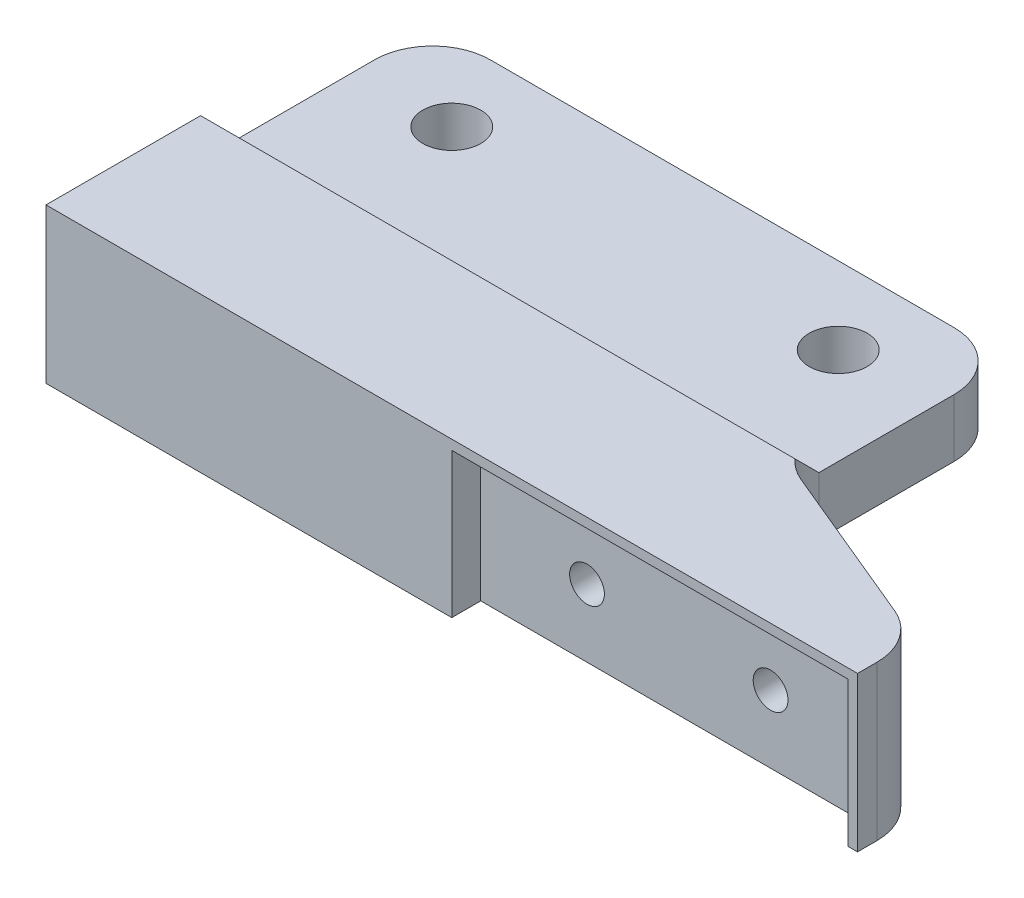
ISO-10303-21;
HEADER;
FILE_DESCRIPTION(('STEP AP214'),'2;1');
FILE_NAME('part.step','',(''),(''),'','','');
FILE_SCHEMA(('AUTOMOTIVE_DESIGN { 1 0 10303 214 1 1 1 1 }'));
ENDSEC;
DATA;
#1=APPLICATION_CONTEXT('core data for automotive mechanical design processes');
#2=APPLICATION_PROTOCOL_DEFINITION('international standard','automotive_design',2000,#1);
#3=PRODUCT_CONTEXT('',#1,'mechanical');
#4=PRODUCT('Part','Part','',(#3));
#5=PRODUCT_RELATED_PRODUCT_CATEGORY('part','',(#4));
#6=PRODUCT_DEFINITION_FORMATION('','',#4);
#7=PRODUCT_DEFINITION_CONTEXT('part definition',#1,'design');
#8=PRODUCT_DEFINITION('design','',#6,#7);
#9=PRODUCT_DEFINITION_SHAPE('','',#8);
#10=(LENGTH_UNIT() NAMED_UNIT(*) SI_UNIT(.MILLI.,.METRE.));
#11=(NAMED_UNIT(*) PLANE_ANGLE_UNIT() SI_UNIT($,.RADIAN.));
#12=(NAMED_UNIT(*) SI_UNIT($,.STERADIAN.) SOLID_ANGLE_UNIT());
#13=UNCERTAINTY_MEASURE_WITH_UNIT(LENGTH_MEASURE(1.E-05),#10,'distance_accuracy_value','');
#14=(GEOMETRIC_REPRESENTATION_CONTEXT(3) GLOBAL_UNCERTAINTY_ASSIGNED_CONTEXT((#13)) GLOBAL_UNIT_ASSIGNED_CONTEXT((#10,
#11,#12)) REPRESENTATION_CONTEXT('',''));
#15=CARTESIAN_POINT('',(0.,0.,0.));
#16=DIRECTION('',(0.,0.,1.));
#17=DIRECTION('',(1.,0.,0.));
#18=AXIS2_PLACEMENT_3D('',#15,#16,#17);
#19=CARTESIAN_POINT('',(0.,8.,0.));
#20=DIRECTION('',(0.,1.,0.));
#21=DIRECTION('',(0.,0.,1.));
#22=AXIS2_PLACEMENT_3D('',#19,#20,#21);
#23=PLANE('',#22);
#24=DIRECTION('',(0.,0.,-1.));
#25=VECTOR('',#24,1.);
#26=CARTESIAN_POINT('',(42.,8.,0.));
#27=LINE('',#26,#25);
#28=CARTESIAN_POINT('',(42.,8.,0.));
#29=VERTEX_POINT('',#28);
#30=CARTESIAN_POINT('',(42.,8.,-1.));
#31=VERTEX_POINT('',#30);
#32=EDGE_CURVE('E257',#29,#31,#27,.T.);
#33=ORIENTED_EDGE('',*,*,#32,.T.);
#34=CARTESIAN_POINT('',(39.,8.,-1.));
#35=DIRECTION('',(0.,1.,0.));
#36=DIRECTION('',(0.,0.,1.));
#37=AXIS2_PLACEMENT_3D('',#34,#35,#36);
#38=CIRCLE('',#37,3.);
#39=CARTESIAN_POINT('',(40.1538461538462,8.,-3.76923076923077));
#40=VERTEX_POINT('',#39);
#41=EDGE_CURVE('E317',#31,#40,#38,.T.);
#42=ORIENTED_EDGE('',*,*,#41,.T.);
#43=DIRECTION('',(-0.923076923076923,0.,-0.384615384615385));
#44=VECTOR('',#43,1.);
#45=CARTESIAN_POINT('',(42.,8.,-3.));
#46=LINE('',#45,#44);
#47=CARTESIAN_POINT('',(31.8461538461539,8.,-7.23076923076923));
#48=VERTEX_POINT('',#47);
#49=EDGE_CURVE('E260',#40,#48,#46,.T.);
#50=ORIENTED_EDGE('',*,*,#49,.T.);
#51=CARTESIAN_POINT('',(33.,8.,-10.));
#52=DIRECTION('',(0.,1.,0.));
#53=DIRECTION('',(0.,0.,1.));
#54=AXIS2_PLACEMENT_3D('',#51,#52,#53);
#55=CIRCLE('',#54,3.);
#56=CARTESIAN_POINT('',(30.7639320225002,8.,-8.));
#57=VERTEX_POINT('',#56);
#58=EDGE_CURVE('E322',#48,#57,#55,.F.);
#59=ORIENTED_EDGE('',*,*,#58,.T.);
#60=DIRECTION('',(-1.,0.,0.));
#61=VECTOR('',#60,1.);
#62=CARTESIAN_POINT('',(42.,8.,-8.));
#63=LINE('',#62,#61);
#64=CARTESIAN_POINT('',(0.,8.,-8.));
#65=VERTEX_POINT('',#64);
#66=EDGE_CURVE('E216',#57,#65,#63,.T.);
#67=ORIENTED_EDGE('',*,*,#66,.T.);
#68=DIRECTION('',(0.,0.,1.));
#69=VECTOR('',#68,1.);
#70=CARTESIAN_POINT('',(0.,8.,-20.));
#71=LINE('',#70,#69);
#72=CARTESIAN_POINT('',(0.,8.,0.));
#73=VERTEX_POINT('',#72);
#74=EDGE_CURVE('E252',#65,#73,#71,.T.);
#75=ORIENTED_EDGE('',*,*,#74,.T.);
#76=DIRECTION('',(1.,0.,0.));
#77=VECTOR('',#76,1.);
#78=CARTESIAN_POINT('',(0.,8.,0.));
#79=LINE('',#78,#77);
#80=EDGE_CURVE('E254',#73,#29,#79,.T.);
#81=ORIENTED_EDGE('',*,*,#80,.T.);
#82=EDGE_LOOP('',(#33,#42,#50,#59,#67,#75,#81));
#83=FACE_BOUND('',#82,.T.);
#84=ADVANCED_FACE('F35',(#83),#23,.T.);
#85=CARTESIAN_POINT('',(0.,0.,0.));
#86=DIRECTION('',(0.,1.,0.));
#87=DIRECTION('',(0.,0.,1.));
#88=AXIS2_PLACEMENT_3D('',#85,#86,#87);
#89=PLANE('',#88);
#90=DIRECTION('',(-1.,0.,0.));
#91=VECTOR('',#90,1.);
#92=CARTESIAN_POINT('',(42.,0.,-8.));
#93=LINE('',#92,#91);
#94=CARTESIAN_POINT('',(29.4,0.,-8.));
#95=VERTEX_POINT('',#94);
#96=CARTESIAN_POINT('',(0.,0.,-8.));
#97=VERTEX_POINT('',#96);
#98=EDGE_CURVE('E237',#95,#97,#93,.T.);
#99=ORIENTED_EDGE('',*,*,#98,.F.);
#100=CARTESIAN_POINT('',(29.4,0.,-5.));
#101=DIRECTION('',(0.,1.,0.));
#102=DIRECTION('',(0.,0.,1.));
#103=AXIS2_PLACEMENT_3D('',#100,#101,#102);
#104=CIRCLE('',#103,3.);
#105=CARTESIAN_POINT('',(30.5538461538462,0.,-7.76923076923077));
#106=VERTEX_POINT('',#105);
#107=EDGE_CURVE('E57',#95,#106,#104,.F.);
#108=ORIENTED_EDGE('',*,*,#107,.T.);
#109=DIRECTION('',(-0.923076923076923,0.,-0.384615384615385));
#110=VECTOR('',#109,1.);
#111=CARTESIAN_POINT('',(42.,0.,-3.));
#112=LINE('',#111,#110);
#113=CARTESIAN_POINT('',(40.1538461538462,0.,-3.76923076923077));
#114=VERTEX_POINT('',#113);
#115=EDGE_CURVE('E255',#114,#106,#112,.T.);
#116=ORIENTED_EDGE('',*,*,#115,.F.);
#117=CARTESIAN_POINT('',(39.,0.,-1.));
#118=DIRECTION('',(0.,1.,0.));
#119=DIRECTION('',(0.,0.,1.));
#120=AXIS2_PLACEMENT_3D('',#117,#118,#119);
#121=CIRCLE('',#120,3.);
#122=CARTESIAN_POINT('',(42.,0.,-1.));
#123=VERTEX_POINT('',#122);
#124=EDGE_CURVE('E313',#114,#123,#121,.F.);
#125=ORIENTED_EDGE('',*,*,#124,.T.);
#126=DIRECTION('',(0.,0.,-1.));
#127=VECTOR('',#126,1.);
#128=CARTESIAN_POINT('',(42.,0.,0.));
#129=LINE('',#128,#127);
#130=CARTESIAN_POINT('',(42.,0.,0.));
#131=VERTEX_POINT('',#130);
#132=EDGE_CURVE('E268',#131,#123,#129,.T.);
#133=ORIENTED_EDGE('',*,*,#132,.F.);
#134=DIRECTION('',(1.,0.,0.));
#135=VECTOR('',#134,1.);
#136=CARTESIAN_POINT('',(0.,0.,0.));
#137=LINE('',#136,#135);
#138=CARTESIAN_POINT('',(41.5,0.,0.));
#139=VERTEX_POINT('',#138);
#140=EDGE_CURVE('E265',#139,#131,#137,.T.);
#141=ORIENTED_EDGE('',*,*,#140,.F.);
#142=DIRECTION('',(0.,0.,1.));
#143=VECTOR('',#142,1.);
#144=CARTESIAN_POINT('',(41.5,0.,-1.5));
#145=LINE('',#144,#143);
#146=CARTESIAN_POINT('',(41.5,0.,-1.5));
#147=VERTEX_POINT('',#146);
#148=EDGE_CURVE('E172',#147,#139,#145,.T.);
#149=ORIENTED_EDGE('',*,*,#148,.F.);
#150=DIRECTION('',(1.,0.,0.));
#151=VECTOR('',#150,1.);
#152=CARTESIAN_POINT('',(21.,0.,-1.5));
#153=LINE('',#152,#151);
#154=CARTESIAN_POINT('',(21.,0.,-1.5));
#155=VERTEX_POINT('',#154);
#156=EDGE_CURVE('E180',#155,#147,#153,.T.);
#157=ORIENTED_EDGE('',*,*,#156,.F.);
#158=DIRECTION('',(0.,0.,1.));
#159=VECTOR('',#158,1.);
#160=CARTESIAN_POINT('',(21.,0.,-1.5));
#161=LINE('',#160,#159);
#162=CARTESIAN_POINT('',(21.,0.,0.));
#163=VERTEX_POINT('',#162);
#164=EDGE_CURVE('E162',#155,#163,#161,.T.);
#165=ORIENTED_EDGE('',*,*,#164,.T.);
#166=CARTESIAN_POINT('',(0.,0.,0.));
#167=VERTEX_POINT('',#166);
#168=EDGE_CURVE('E266',#167,#163,#137,.T.);
#169=ORIENTED_EDGE('',*,*,#168,.F.);
#170=DIRECTION('',(0.,0.,1.));
#171=VECTOR('',#170,1.);
#172=CARTESIAN_POINT('',(0.,0.,-20.));
#173=LINE('',#172,#171);
#174=EDGE_CURVE('E251',#97,#167,#173,.T.);
#175=ORIENTED_EDGE('',*,*,#174,.F.);
#176=EDGE_LOOP('',(#99,#108,#116,#125,#133,#141,#149,#157,#165,#169,#175));
#177=FACE_BOUND('',#176,.T.);
#178=ADVANCED_FACE('F185',(#177),#89,.F.);
#179=CARTESIAN_POINT('',(0.,8.,-20.));
#180=DIRECTION('',(1.,0.,0.));
#181=DIRECTION('',(0.,0.,-1.));
#182=AXIS2_PLACEMENT_3D('',#179,#180,#181);
#183=PLANE('',#182);
#184=DIRECTION('',(0.,0.,1.));
#185=VECTOR('',#184,1.);
#186=CARTESIAN_POINT('',(0.,6.,-20.));
#187=LINE('',#186,#185);
#188=CARTESIAN_POINT('',(0.,6.,-17.));
#189=VERTEX_POINT('',#188);
#190=CARTESIAN_POINT('',(0.,6.,-9.99999999999999));
#191=VERTEX_POINT('',#190);
#192=EDGE_CURVE('E211',#189,#191,#187,.T.);
#193=ORIENTED_EDGE('',*,*,#192,.F.);
#194=DIRECTION('',(0.,-1.,0.));
#195=VECTOR('',#194,1.);
#196=CARTESIAN_POINT('',(0.,8.,-17.));
#197=LINE('',#196,#195);
#198=CARTESIAN_POINT('',(0.,3.,-17.));
#199=VERTEX_POINT('',#198);
#200=EDGE_CURVE('E277',#189,#199,#197,.T.);
#201=ORIENTED_EDGE('',*,*,#200,.T.);
#202=DIRECTION('',(0.,0.,-1.));
#203=VECTOR('',#202,1.);
#204=CARTESIAN_POINT('',(0.,3.,-20.));
#205=LINE('',#204,#203);
#206=CARTESIAN_POINT('',(0.,3.,-8.));
#207=VERTEX_POINT('',#206);
#208=EDGE_CURVE('E234',#207,#199,#205,.T.);
#209=ORIENTED_EDGE('',*,*,#208,.F.);
#210=DIRECTION('',(0.,1.,0.));
#211=VECTOR('',#210,1.);
#212=CARTESIAN_POINT('',(0.,0.,-8.));
#213=LINE('',#212,#211);
#214=EDGE_CURVE('E231',#97,#207,#213,.T.);
#215=ORIENTED_EDGE('',*,*,#214,.F.);
#216=ORIENTED_EDGE('',*,*,#174,.T.);
#217=DIRECTION('',(0.,-1.,0.));
#218=VECTOR('',#217,1.);
#219=CARTESIAN_POINT('',(0.,8.,0.));
#220=LINE('',#219,#218);
#221=EDGE_CURVE('E274',#73,#167,#220,.T.);
#222=ORIENTED_EDGE('',*,*,#221,.F.);
#223=ORIENTED_EDGE('',*,*,#74,.F.);
#224=DIRECTION('',(0.,0.707106781186549,0.707106781186546));
#225=VECTOR('',#224,1.);
#226=CARTESIAN_POINT('',(0.,6.,-9.99999999999999));
#227=LINE('',#226,#225);
#228=EDGE_CURVE('E213',#191,#65,#227,.T.);
#229=ORIENTED_EDGE('',*,*,#228,.F.);
#230=EDGE_LOOP('',(#193,#201,#209,#215,#216,#222,#223,#229));
#231=FACE_BOUND('',#230,.T.);
#232=ADVANCED_FACE('F341',(#231),#183,.F.);
#233=CARTESIAN_POINT('',(0.,8.,0.));
#234=DIRECTION('',(0.,0.,-1.));
#235=DIRECTION('',(-1.,0.,0.));
#236=AXIS2_PLACEMENT_3D('',#233,#234,#235);
#237=PLANE('',#236);
#238=ORIENTED_EDGE('',*,*,#168,.T.);
#239=DIRECTION('',(0.,-1.,0.));
#240=VECTOR('',#239,1.);
#241=CARTESIAN_POINT('',(21.,0.,0.));
#242=LINE('',#241,#240);
#243=CARTESIAN_POINT('',(21.,7.5,0.));
#244=VERTEX_POINT('',#243);
#245=EDGE_CURVE('E168',#244,#163,#242,.T.);
#246=ORIENTED_EDGE('',*,*,#245,.F.);
#247=DIRECTION('',(-1.,0.,0.));
#248=VECTOR('',#247,1.);
#249=CARTESIAN_POINT('',(21.,7.5,0.));
#250=LINE('',#249,#248);
#251=CARTESIAN_POINT('',(41.5,7.5,0.));
#252=VERTEX_POINT('',#251);
#253=EDGE_CURVE('E183',#252,#244,#250,.T.);
#254=ORIENTED_EDGE('',*,*,#253,.F.);
#255=DIRECTION('',(0.,1.,0.));
#256=VECTOR('',#255,1.);
#257=CARTESIAN_POINT('',(41.5,0.,0.));
#258=LINE('',#257,#256);
#259=EDGE_CURVE('E193',#139,#252,#258,.T.);
#260=ORIENTED_EDGE('',*,*,#259,.F.);
#261=ORIENTED_EDGE('',*,*,#140,.T.);
#262=DIRECTION('',(0.,-1.,0.));
#263=VECTOR('',#262,1.);
#264=CARTESIAN_POINT('',(42.,8.,0.));
#265=LINE('',#264,#263);
#266=EDGE_CURVE('E263',#29,#131,#265,.T.);
#267=ORIENTED_EDGE('',*,*,#266,.F.);
#268=ORIENTED_EDGE('',*,*,#80,.F.);
#269=ORIENTED_EDGE('',*,*,#221,.T.);
#270=EDGE_LOOP('',(#238,#246,#254,#260,#261,#267,#268,#269));
#271=FACE_BOUND('',#270,.T.);
#272=ADVANCED_FACE('F381',(#271),#237,.F.);
#273=CARTESIAN_POINT('',(42.,8.,0.));
#274=DIRECTION('',(-1.,0.,0.));
#275=DIRECTION('',(0.,0.,1.));
#276=AXIS2_PLACEMENT_3D('',#273,#274,#275);
#277=PLANE('',#276);
#278=ORIENTED_EDGE('',*,*,#132,.T.);
#279=DIRECTION('',(0.,-1.,0.));
#280=VECTOR('',#279,1.);
#281=CARTESIAN_POINT('',(42.,8.,-1.));
#282=LINE('',#281,#280);
#283=EDGE_CURVE('E315',#123,#31,#282,.F.);
#284=ORIENTED_EDGE('',*,*,#283,.T.);
#285=ORIENTED_EDGE('',*,*,#32,.F.);
#286=ORIENTED_EDGE('',*,*,#266,.T.);
#287=EDGE_LOOP('',(#278,#284,#285,#286));
#288=FACE_BOUND('',#287,.T.);
#289=ADVANCED_FACE('F377',(#288),#277,.F.);
#290=CARTESIAN_POINT('',(42.,8.,-3.));
#291=DIRECTION('',(-0.384615384615385,0.,0.923076923076923));
#292=DIRECTION('',(0.923076923076923,0.,0.384615384615385));
#293=AXIS2_PLACEMENT_3D('',#290,#291,#292);
#294=PLANE('',#293);
#295=CARTESIAN_POINT('',(36.,3.5,-5.5));
#296=DIRECTION('',(-0.384615384615385,0.,0.923076923076923));
#297=DIRECTION('',(0.923076923076923,0.,0.384615384615385));
#298=AXIS2_PLACEMENT_3D('',#295,#296,#297);
#299=ELLIPSE('',#298,0.974999999999997,0.899999999999997);
#300=CARTESIAN_POINT('',(36.9,3.5,-5.125));
#301=VERTEX_POINT('',#300);
#302=EDGE_CURVE('E207',#301,#301,#299,.T.);
#303=ORIENTED_EDGE('',*,*,#302,.T.);
#304=EDGE_LOOP('',(#303));
#305=FACE_BOUND('',#304,.T.);
#306=ORIENTED_EDGE('',*,*,#115,.T.);
#307=DIRECTION('',(0.,-1.,0.));
#308=VECTOR('',#307,1.);
#309=CARTESIAN_POINT('',(30.5538461538462,8.,-7.76923076923077));
#310=LINE('',#309,#308);
#311=CARTESIAN_POINT('',(30.5538461538462,3.,-7.76923076923077));
#312=VERTEX_POINT('',#311);
#313=EDGE_CURVE('E43',#106,#312,#310,.F.);
#314=ORIENTED_EDGE('',*,*,#313,.T.);
#315=DIRECTION('',(0.923076923076923,0.,0.384615384615385));
#316=VECTOR('',#315,1.);
#317=CARTESIAN_POINT('',(35.9644970414201,3.,-5.51479289940828));
#318=LINE('',#317,#316);
#319=CARTESIAN_POINT('',(31.8461538461539,3.,-7.23076923076923));
#320=VERTEX_POINT('',#319);
#321=EDGE_CURVE('E308',#312,#320,#318,.T.);
#322=ORIENTED_EDGE('',*,*,#321,.T.);
#323=DIRECTION('',(0.,-1.,0.));
#324=VECTOR('',#323,1.);
#325=CARTESIAN_POINT('',(31.8461538461539,8.,-7.23076923076923));
#326=LINE('',#325,#324);
#327=EDGE_CURVE('E306',#320,#48,#326,.F.);
#328=ORIENTED_EDGE('',*,*,#327,.T.);
#329=ORIENTED_EDGE('',*,*,#49,.F.);
#330=DIRECTION('',(0.,-1.,0.));
#331=VECTOR('',#330,1.);
#332=CARTESIAN_POINT('',(40.1538461538462,8.,-3.76923076923077));
#333=LINE('',#332,#331);
#334=EDGE_CURVE('E310',#40,#114,#333,.T.);
#335=ORIENTED_EDGE('',*,*,#334,.T.);
#336=EDGE_LOOP('',(#306,#314,#322,#328,#329,#335));
#337=FACE_BOUND('',#336,.T.);
#338=ADVANCED_FACE('F373',(#305,#337),#294,.F.);
#339=CARTESIAN_POINT('',(30.,8.,-8.));
#340=DIRECTION('',(-1.,0.,0.));
#341=DIRECTION('',(0.,0.,1.));
#342=AXIS2_PLACEMENT_3D('',#339,#340,#341);
#343=PLANE('',#342);
#344=DIRECTION('',(0.,0.,-1.));
#345=VECTOR('',#344,1.);
#346=CARTESIAN_POINT('',(30.,3.,-8.));
#347=LINE('',#346,#345);
#348=CARTESIAN_POINT('',(30.,3.,-10.));
#349=VERTEX_POINT('',#348);
#350=CARTESIAN_POINT('',(30.,3.,-17.));
#351=VERTEX_POINT('',#350);
#352=EDGE_CURVE('E248',#349,#351,#347,.T.);
#353=ORIENTED_EDGE('',*,*,#352,.T.);
#354=DIRECTION('',(0.,-1.,0.));
#355=VECTOR('',#354,1.);
#356=CARTESIAN_POINT('',(30.,8.,-17.));
#357=LINE('',#356,#355);
#358=CARTESIAN_POINT('',(30.,6.,-17.));
#359=VERTEX_POINT('',#358);
#360=EDGE_CURVE('E304',#351,#359,#357,.F.);
#361=ORIENTED_EDGE('',*,*,#360,.T.);
#362=DIRECTION('',(0.,0.,1.));
#363=VECTOR('',#362,1.);
#364=CARTESIAN_POINT('',(30.,6.,-8.));
#365=LINE('',#364,#363);
#366=CARTESIAN_POINT('',(30.,6.,-9.99999999999999));
#367=VERTEX_POINT('',#366);
#368=EDGE_CURVE('E228',#359,#367,#365,.T.);
#369=ORIENTED_EDGE('',*,*,#368,.T.);
#370=DIRECTION('',(0.,-1.,0.));
#371=VECTOR('',#370,1.);
#372=CARTESIAN_POINT('',(30.,3.,-10.));
#373=LINE('',#372,#371);
#374=EDGE_CURVE('E301',#367,#349,#373,.T.);
#375=ORIENTED_EDGE('',*,*,#374,.T.);
#376=EDGE_LOOP('',(#353,#361,#369,#375));
#377=FACE_BOUND('',#376,.T.);
#378=ADVANCED_FACE('F369',(#377),#343,.F.);
#379=CARTESIAN_POINT('',(30.,8.,-20.));
#380=DIRECTION('',(0.,0.,1.));
#381=DIRECTION('',(1.,0.,0.));
#382=AXIS2_PLACEMENT_3D('',#379,#380,#381);
#383=PLANE('',#382);
#384=DIRECTION('',(-1.,0.,0.));
#385=VECTOR('',#384,1.);
#386=CARTESIAN_POINT('',(42.,3.,-20.));
#387=LINE('',#386,#385);
#388=CARTESIAN_POINT('',(27.,3.,-20.));
#389=VERTEX_POINT('',#388);
#390=CARTESIAN_POINT('',(3.00000000000002,3.,-20.));
#391=VERTEX_POINT('',#390);
#392=EDGE_CURVE('E238',#389,#391,#387,.T.);
#393=ORIENTED_EDGE('',*,*,#392,.T.);
#394=DIRECTION('',(0.,-1.,0.));
#395=VECTOR('',#394,1.);
#396=CARTESIAN_POINT('',(3.,8.,-20.));
#397=LINE('',#396,#395);
#398=CARTESIAN_POINT('',(3.00000000000002,6.,-20.));
#399=VERTEX_POINT('',#398);
#400=EDGE_CURVE('E295',#391,#399,#397,.F.);
#401=ORIENTED_EDGE('',*,*,#400,.T.);
#402=DIRECTION('',(-1.,0.,0.));
#403=VECTOR('',#402,1.);
#404=CARTESIAN_POINT('',(42.,6.,-20.));
#405=LINE('',#404,#403);
#406=CARTESIAN_POINT('',(27.,6.,-20.));
#407=VERTEX_POINT('',#406);
#408=EDGE_CURVE('E215',#407,#399,#405,.T.);
#409=ORIENTED_EDGE('',*,*,#408,.F.);
#410=DIRECTION('',(0.,-1.,0.));
#411=VECTOR('',#410,1.);
#412=CARTESIAN_POINT('',(27.,8.,-20.));
#413=LINE('',#412,#411);
#414=EDGE_CURVE('E292',#407,#389,#413,.T.);
#415=ORIENTED_EDGE('',*,*,#414,.T.);
#416=EDGE_LOOP('',(#393,#401,#409,#415));
#417=FACE_BOUND('',#416,.T.);
#418=ADVANCED_FACE('F366',(#417),#383,.F.);
#419=CARTESIAN_POINT('',(25.,8.,-16.));
#420=DIRECTION('',(0.,-1.,0.));
#421=DIRECTION('',(0.,0.,-1.));
#422=AXIS2_PLACEMENT_3D('',#419,#420,#421);
#423=CYLINDRICAL_SURFACE('',#422,1.5);
#424=CARTESIAN_POINT('',(25.,6.,-16.));
#425=DIRECTION('',(0.,-1.,0.));
#426=DIRECTION('',(0.,0.,-1.));
#427=AXIS2_PLACEMENT_3D('',#424,#425,#426);
#428=CIRCLE('',#427,1.5);
#429=CARTESIAN_POINT('',(25.,6.,-17.5));
#430=VERTEX_POINT('',#429);
#431=EDGE_CURVE('E225',#430,#430,#428,.T.);
#432=CARTESIAN_POINT('',(25.,3.,-16.));
#433=DIRECTION('',(0.,1.,0.));
#434=DIRECTION('',(0.,0.,1.));
#435=AXIS2_PLACEMENT_3D('',#432,#433,#434);
#436=CIRCLE('',#435,1.5);
#437=CARTESIAN_POINT('',(25.,3.,-17.5));
#438=VERTEX_POINT('',#437);
#439=EDGE_CURVE('E245',#438,#438,#436,.T.);
#440=CARTESIAN_POINT('',(25.,6.,-17.5));
#441=CARTESIAN_POINT('',(25.,5.96875,-17.5));
#442=CARTESIAN_POINT('',(25.,5.9375,-17.5));
#443=CARTESIAN_POINT('',(25.,5.875,-17.5));
#444=CARTESIAN_POINT('',(25.,5.84375,-17.5));
#445=CARTESIAN_POINT('',(25.,5.78125,-17.5));
#446=CARTESIAN_POINT('',(25.,5.75,-17.5));
#447=CARTESIAN_POINT('',(25.,5.6875,-17.5));
#448=CARTESIAN_POINT('',(25.,5.65625,-17.5));
#449=CARTESIAN_POINT('',(25.,5.59375,-17.5));
#450=CARTESIAN_POINT('',(25.,5.5625,-17.5));
#451=CARTESIAN_POINT('',(25.,5.5,-17.5));
#452=CARTESIAN_POINT('',(25.,5.46875,-17.5));
#453=CARTESIAN_POINT('',(25.,5.40625,-17.5));
#454=CARTESIAN_POINT('',(25.,5.375,-17.5));
#455=CARTESIAN_POINT('',(25.,5.3125,-17.5));
#456=CARTESIAN_POINT('',(25.,5.28125,-17.5));
#457=CARTESIAN_POINT('',(25.,5.21875,-17.5));
#458=CARTESIAN_POINT('',(25.,5.1875,-17.5));
#459=CARTESIAN_POINT('',(25.,5.125,-17.5));
#460=CARTESIAN_POINT('',(25.,5.09375,-17.5));
#461=CARTESIAN_POINT('',(25.,5.03125,-17.5));
#462=CARTESIAN_POINT('',(25.,5.,-17.5));
#463=CARTESIAN_POINT('',(25.,4.9375,-17.5));
#464=CARTESIAN_POINT('',(25.,4.90625,-17.5));
#465=CARTESIAN_POINT('',(25.,4.84375,-17.5));
#466=CARTESIAN_POINT('',(25.,4.8125,-17.5));
#467=CARTESIAN_POINT('',(25.,4.75,-17.5));
#468=CARTESIAN_POINT('',(25.,4.71875,-17.5));
#469=CARTESIAN_POINT('',(25.,4.65625,-17.5));
#470=CARTESIAN_POINT('',(25.,4.625,-17.5));
#471=CARTESIAN_POINT('',(25.,4.5625,-17.5));
#472=CARTESIAN_POINT('',(25.,4.53125,-17.5));
#473=CARTESIAN_POINT('',(25.,4.46875,-17.5));
#474=CARTESIAN_POINT('',(25.,4.4375,-17.5));
#475=CARTESIAN_POINT('',(25.,4.375,-17.5));
#476=CARTESIAN_POINT('',(25.,4.34375,-17.5));
#477=CARTESIAN_POINT('',(25.,4.28125,-17.5));
#478=CARTESIAN_POINT('',(25.,4.25,-17.5));
#479=CARTESIAN_POINT('',(25.,4.1875,-17.5));
#480=CARTESIAN_POINT('',(25.,4.15625,-17.5));
#481=CARTESIAN_POINT('',(25.,4.09375,-17.5));
#482=CARTESIAN_POINT('',(25.,4.0625,-17.5));
#483=CARTESIAN_POINT('',(25.,4.,-17.5));
#484=CARTESIAN_POINT('',(25.,3.96875,-17.5));
#485=CARTESIAN_POINT('',(25.,3.90625,-17.5));
#486=CARTESIAN_POINT('',(25.,3.875,-17.5));
#487=CARTESIAN_POINT('',(25.,3.8125,-17.5));
#488=CARTESIAN_POINT('',(25.,3.78125,-17.5));
#489=CARTESIAN_POINT('',(25.,3.71875,-17.5));
#490=CARTESIAN_POINT('',(25.,3.6875,-17.5));
#491=CARTESIAN_POINT('',(25.,3.625,-17.5));
#492=CARTESIAN_POINT('',(25.,3.59375,-17.5));
#493=CARTESIAN_POINT('',(25.,3.53125,-17.5));
#494=CARTESIAN_POINT('',(25.,3.5,-17.5));
#495=CARTESIAN_POINT('',(25.,3.4375,-17.5));
#496=CARTESIAN_POINT('',(25.,3.40625,-17.5));
#497=CARTESIAN_POINT('',(25.,3.34375,-17.5));
#498=CARTESIAN_POINT('',(25.,3.3125,-17.5));
#499=CARTESIAN_POINT('',(25.,3.25,-17.5));
#500=CARTESIAN_POINT('',(25.,3.21875,-17.5));
#501=CARTESIAN_POINT('',(25.,3.15625,-17.5));
#502=CARTESIAN_POINT('',(25.,3.125,-17.5));
#503=CARTESIAN_POINT('',(25.,3.0625,-17.5));
#504=CARTESIAN_POINT('',(25.,3.03125,-17.5));
#505=CARTESIAN_POINT('',(25.,3.,-17.5));
#506=B_SPLINE_CURVE_WITH_KNOTS('',3,(#440,#441,#442,#443,#444,#445,#446,#447,#448,#449,#450,
#451,#452,#453,#454,#455,#456,#457,#458,#459,#460,#461,#462,#463,#464,#465,#466,#467,#468,#469,
#470,#471,#472,#473,#474,#475,#476,#477,#478,#479,#480,#481,#482,#483,#484,#485,#486,#487,#488,
#489,#490,#491,#492,#493,#494,#495,#496,#497,#498,#499,#500,#501,#502,#503,#504,#505),
.UNSPECIFIED.,.F.,.F.,(4,2,2,2,2,2,2,2,2,2,2,2,2,2,2,2,2,2,2,2,2,2,2,2,2,2,2,2,2,2,2,2,4),(0.,
0.0937500000000001,0.1875,0.28125,0.375,0.46875,0.5625,0.656250000000001,0.750000000000001,
0.843750000000001,0.937500000000001,1.03125,1.125,1.21875,1.3125,1.40625,1.5,1.59375,1.6875,
1.78125,1.875,1.96875,2.0625,2.15625,2.25,2.34375,2.4375,2.53125,2.625,2.71875,2.8125,2.90625,
3.),.UNSPECIFIED.);
#507=EDGE_CURVE('BSEAM363',#430,#438,#506,.T.);
#508=ORIENTED_EDGE('',*,*,#431,.F.);
#509=ORIENTED_EDGE('',*,*,#439,.F.);
#510=ORIENTED_EDGE('',*,*,#507,.T.);
#511=ORIENTED_EDGE('',*,*,#507,.F.);
#512=EDGE_LOOP('',(#508,#510,#509,#511));
#513=FACE_BOUND('',#512,.T.);
#514=ADVANCED_FACE('F363',(#513),#423,.F.);
#515=CARTESIAN_POINT('',(5.,8.,-16.));
#516=DIRECTION('',(0.,-1.,0.));
#517=DIRECTION('',(0.,0.,-1.));
#518=AXIS2_PLACEMENT_3D('',#515,#516,#517);
#519=CYLINDRICAL_SURFACE('',#518,1.5);
#520=CARTESIAN_POINT('',(5.,6.,-16.));
#521=DIRECTION('',(0.,-1.,0.));
#522=DIRECTION('',(0.,0.,-1.));
#523=AXIS2_PLACEMENT_3D('',#520,#521,#522);
#524=CIRCLE('',#523,1.5);
#525=CARTESIAN_POINT('',(5.,6.,-17.5));
#526=VERTEX_POINT('',#525);
#527=EDGE_CURVE('E219',#526,#526,#524,.T.);
#528=CARTESIAN_POINT('',(5.,3.,-16.));
#529=DIRECTION('',(0.,1.,0.));
#530=DIRECTION('',(0.,0.,1.));
#531=AXIS2_PLACEMENT_3D('',#528,#529,#530);
#532=CIRCLE('',#531,1.5);
#533=CARTESIAN_POINT('',(5.,3.,-17.5));
#534=VERTEX_POINT('',#533);
#535=EDGE_CURVE('E241',#534,#534,#532,.T.);
#536=CARTESIAN_POINT('',(5.,6.,-17.5));
#537=CARTESIAN_POINT('',(5.,5.96875,-17.5));
#538=CARTESIAN_POINT('',(5.,5.9375,-17.5));
#539=CARTESIAN_POINT('',(5.,5.875,-17.5));
#540=CARTESIAN_POINT('',(5.,5.84375,-17.5));
#541=CARTESIAN_POINT('',(5.,5.78125,-17.5));
#542=CARTESIAN_POINT('',(5.,5.75,-17.5));
#543=CARTESIAN_POINT('',(5.,5.6875,-17.5));
#544=CARTESIAN_POINT('',(5.,5.65625,-17.5));
#545=CARTESIAN_POINT('',(5.,5.59375,-17.5));
#546=CARTESIAN_POINT('',(5.,5.5625,-17.5));
#547=CARTESIAN_POINT('',(5.,5.5,-17.5));
#548=CARTESIAN_POINT('',(5.,5.46875,-17.5));
#549=CARTESIAN_POINT('',(5.,5.40625,-17.5));
#550=CARTESIAN_POINT('',(5.,5.375,-17.5));
#551=CARTESIAN_POINT('',(5.,5.3125,-17.5));
#552=CARTESIAN_POINT('',(5.,5.28125,-17.5));
#553=CARTESIAN_POINT('',(5.,5.21875,-17.5));
#554=CARTESIAN_POINT('',(5.,5.1875,-17.5));
#555=CARTESIAN_POINT('',(5.,5.125,-17.5));
#556=CARTESIAN_POINT('',(5.,5.09375,-17.5));
#557=CARTESIAN_POINT('',(5.,5.03125,-17.5));
#558=CARTESIAN_POINT('',(5.,5.,-17.5));
#559=CARTESIAN_POINT('',(5.,4.9375,-17.5));
#560=CARTESIAN_POINT('',(5.,4.90625,-17.5));
#561=CARTESIAN_POINT('',(5.,4.84375,-17.5));
#562=CARTESIAN_POINT('',(5.,4.8125,-17.5));
#563=CARTESIAN_POINT('',(5.,4.75,-17.5));
#564=CARTESIAN_POINT('',(5.,4.71875,-17.5));
#565=CARTESIAN_POINT('',(5.,4.65625,-17.5));
#566=CARTESIAN_POINT('',(5.,4.625,-17.5));
#567=CARTESIAN_POINT('',(5.,4.5625,-17.5));
#568=CARTESIAN_POINT('',(5.,4.53125,-17.5));
#569=CARTESIAN_POINT('',(5.,4.46875,-17.5));
#570=CARTESIAN_POINT('',(5.,4.4375,-17.5));
#571=CARTESIAN_POINT('',(5.,4.375,-17.5));
#572=CARTESIAN_POINT('',(5.,4.34375,-17.5));
#573=CARTESIAN_POINT('',(5.,4.28125,-17.5));
#574=CARTESIAN_POINT('',(5.,4.25,-17.5));
#575=CARTESIAN_POINT('',(5.,4.1875,-17.5));
#576=CARTESIAN_POINT('',(5.,4.15625,-17.5));
#577=CARTESIAN_POINT('',(5.,4.09375,-17.5));
#578=CARTESIAN_POINT('',(5.,4.0625,-17.5));
#579=CARTESIAN_POINT('',(5.,4.,-17.5));
#580=CARTESIAN_POINT('',(5.,3.96875,-17.5));
#581=CARTESIAN_POINT('',(5.,3.90625,-17.5));
#582=CARTESIAN_POINT('',(5.,3.875,-17.5));
#583=CARTESIAN_POINT('',(5.,3.8125,-17.5));
#584=CARTESIAN_POINT('',(5.,3.78125,-17.5));
#585=CARTESIAN_POINT('',(5.,3.71875,-17.5));
#586=CARTESIAN_POINT('',(5.,3.6875,-17.5));
#587=CARTESIAN_POINT('',(5.,3.625,-17.5));
#588=CARTESIAN_POINT('',(5.,3.59375,-17.5));
#589=CARTESIAN_POINT('',(5.,3.53125,-17.5));
#590=CARTESIAN_POINT('',(5.,3.5,-17.5));
#591=CARTESIAN_POINT('',(5.,3.4375,-17.5));
#592=CARTESIAN_POINT('',(5.,3.40625,-17.5));
#593=CARTESIAN_POINT('',(5.,3.34375,-17.5));
#594=CARTESIAN_POINT('',(5.,3.3125,-17.5));
#595=CARTESIAN_POINT('',(5.,3.25,-17.5));
#596=CARTESIAN_POINT('',(5.,3.21875,-17.5));
#597=CARTESIAN_POINT('',(5.,3.15625,-17.5));
#598=CARTESIAN_POINT('',(5.,3.125,-17.5));
#599=CARTESIAN_POINT('',(5.,3.0625,-17.5));
#600=CARTESIAN_POINT('',(5.,3.03125,-17.5));
#601=CARTESIAN_POINT('',(5.,3.,-17.5));
#602=B_SPLINE_CURVE_WITH_KNOTS('',3,(#536,#537,#538,#539,#540,#541,#542,#543,#544,#545,#546,
#547,#548,#549,#550,#551,#552,#553,#554,#555,#556,#557,#558,#559,#560,#561,#562,#563,#564,#565,
#566,#567,#568,#569,#570,#571,#572,#573,#574,#575,#576,#577,#578,#579,#580,#581,#582,#583,#584,
#585,#586,#587,#588,#589,#590,#591,#592,#593,#594,#595,#596,#597,#598,#599,#600,#601),
.UNSPECIFIED.,.F.,.F.,(4,2,2,2,2,2,2,2,2,2,2,2,2,2,2,2,2,2,2,2,2,2,2,2,2,2,2,2,2,2,2,2,4),(0.,
0.0937500000000001,0.1875,0.28125,0.375,0.46875,0.5625,0.656250000000001,0.750000000000001,
0.843750000000001,0.937500000000001,1.03125,1.125,1.21875,1.3125,1.40625,1.5,1.59375,1.6875,
1.78125,1.875,1.96875,2.0625,2.15625,2.25,2.34375,2.4375,2.53125,2.625,2.71875,2.8125,2.90625,
3.),.UNSPECIFIED.);
#603=EDGE_CURVE('BSEAM443',#526,#534,#602,.T.);
#604=ORIENTED_EDGE('',*,*,#527,.F.);
#605=ORIENTED_EDGE('',*,*,#535,.F.);
#606=ORIENTED_EDGE('',*,*,#603,.T.);
#607=ORIENTED_EDGE('',*,*,#603,.F.);
#608=EDGE_LOOP('',(#604,#606,#605,#607));
#609=FACE_BOUND('',#608,.T.);
#610=ADVANCED_FACE('F443',(#609),#519,.F.);
#611=CARTESIAN_POINT('',(42.,0.,-8.));
#612=DIRECTION('',(0.,0.,1.));
#613=DIRECTION('',(1.,0.,0.));
#614=AXIS2_PLACEMENT_3D('',#611,#612,#613);
#615=PLANE('',#614);
#616=DIRECTION('',(-1.,0.,0.));
#617=VECTOR('',#616,1.);
#618=CARTESIAN_POINT('',(42.,3.,-8.));
#619=LINE('',#618,#617);
#620=CARTESIAN_POINT('',(29.4,3.,-8.));
#621=VERTEX_POINT('',#620);
#622=EDGE_CURVE('E242',#621,#207,#619,.T.);
#623=ORIENTED_EDGE('',*,*,#622,.F.);
#624=DIRECTION('',(0.,-1.,0.));
#625=VECTOR('',#624,1.);
#626=CARTESIAN_POINT('',(29.4,0.,-8.));
#627=LINE('',#626,#625);
#628=EDGE_CURVE('E327',#621,#95,#627,.T.);
#629=ORIENTED_EDGE('',*,*,#628,.T.);
#630=ORIENTED_EDGE('',*,*,#98,.T.);
#631=ORIENTED_EDGE('',*,*,#214,.T.);
#632=EDGE_LOOP('',(#623,#629,#630,#631));
#633=FACE_BOUND('',#632,.T.);
#634=ADVANCED_FACE('F333',(#633),#615,.F.);
#635=CARTESIAN_POINT('',(42.,3.,-20.));
#636=DIRECTION('',(0.,1.,0.));
#637=DIRECTION('',(0.,0.,1.));
#638=AXIS2_PLACEMENT_3D('',#635,#636,#637);
#639=PLANE('',#638);
#640=ORIENTED_EDGE('',*,*,#439,.T.);
#641=EDGE_LOOP('',(#640));
#642=FACE_BOUND('',#641,.T.);
#643=ORIENTED_EDGE('',*,*,#535,.T.);
#644=EDGE_LOOP('',(#643));
#645=FACE_BOUND('',#644,.T.);
#646=ORIENTED_EDGE('',*,*,#208,.T.);
#647=CARTESIAN_POINT('',(3.,3.,-17.));
#648=DIRECTION('',(0.,1.,0.));
#649=DIRECTION('',(0.,0.,1.));
#650=AXIS2_PLACEMENT_3D('',#647,#648,#649);
#651=CIRCLE('',#650,3.);
#652=EDGE_CURVE('E290',#199,#391,#651,.F.);
#653=ORIENTED_EDGE('',*,*,#652,.T.);
#654=ORIENTED_EDGE('',*,*,#392,.F.);
#655=CARTESIAN_POINT('',(27.,3.,-17.));
#656=DIRECTION('',(0.,1.,0.));
#657=DIRECTION('',(0.,0.,1.));
#658=AXIS2_PLACEMENT_3D('',#655,#656,#657);
#659=CIRCLE('',#658,3.);
#660=EDGE_CURVE('E288',#389,#351,#659,.F.);
#661=ORIENTED_EDGE('',*,*,#660,.T.);
#662=ORIENTED_EDGE('',*,*,#352,.F.);
#663=CARTESIAN_POINT('',(33.,3.,-10.));
#664=DIRECTION('',(0.,1.,0.));
#665=DIRECTION('',(0.,0.,1.));
#666=AXIS2_PLACEMENT_3D('',#663,#664,#665);
#667=CIRCLE('',#666,3.);
#668=EDGE_CURVE('E319',#349,#320,#667,.T.);
#669=ORIENTED_EDGE('',*,*,#668,.T.);
#670=ORIENTED_EDGE('',*,*,#321,.F.);
#671=CARTESIAN_POINT('',(29.4,3.,-5.));
#672=DIRECTION('',(0.,1.,0.));
#673=DIRECTION('',(0.,0.,1.));
#674=AXIS2_PLACEMENT_3D('',#671,#672,#673);
#675=CIRCLE('',#674,3.);
#676=EDGE_CURVE('E11',#312,#621,#675,.T.);
#677=ORIENTED_EDGE('',*,*,#676,.T.);
#678=ORIENTED_EDGE('',*,*,#622,.T.);
#679=EDGE_LOOP('',(#646,#653,#654,#661,#662,#669,#670,#677,#678));
#680=FACE_BOUND('',#679,.T.);
#681=ADVANCED_FACE('F346',(#642,#645,#680),#639,.F.);
#682=CARTESIAN_POINT('',(42.,6.,-9.99999999999999));
#683=DIRECTION('',(0.,-0.707106781186546,0.707106781186549));
#684=DIRECTION('',(0.,-0.707106781186549,-0.707106781186546));
#685=AXIS2_PLACEMENT_3D('',#682,#683,#684);
#686=PLANE('',#685);
#687=DIRECTION('',(-1.,0.,0.));
#688=VECTOR('',#687,1.);
#689=CARTESIAN_POINT('',(42.,6.,-9.99999999999999));
#690=LINE('',#689,#688);
#691=EDGE_CURVE('E220',#367,#191,#690,.T.);
#692=ORIENTED_EDGE('',*,*,#691,.T.);
#693=ORIENTED_EDGE('',*,*,#228,.T.);
#694=ORIENTED_EDGE('',*,*,#66,.F.);
#695=CARTESIAN_POINT('',(33.,5.99999999999999,-10.));
#696=DIRECTION('',(0.,-0.707106781186546,0.707106781186549));
#697=DIRECTION('',(0.,0.707106781186549,0.707106781186546));
#698=AXIS2_PLACEMENT_3D('',#695,#696,#697);
#699=ELLIPSE('',#698,4.24264068711929,3.);
#700=EDGE_CURVE('E325',#57,#367,#699,.T.);
#701=ORIENTED_EDGE('',*,*,#700,.T.);
#702=EDGE_LOOP('',(#692,#693,#694,#701));
#703=FACE_BOUND('',#702,.T.);
#704=ADVANCED_FACE('F413',(#703),#686,.F.);
#705=CARTESIAN_POINT('',(42.,6.,-20.));
#706=DIRECTION('',(0.,-1.,0.));
#707=DIRECTION('',(0.,0.,-1.));
#708=AXIS2_PLACEMENT_3D('',#705,#706,#707);
#709=PLANE('',#708);
#710=ORIENTED_EDGE('',*,*,#431,.T.);
#711=EDGE_LOOP('',(#710));
#712=FACE_BOUND('',#711,.T.);
#713=ORIENTED_EDGE('',*,*,#527,.T.);
#714=EDGE_LOOP('',(#713));
#715=FACE_BOUND('',#714,.T.);
#716=ORIENTED_EDGE('',*,*,#408,.T.);
#717=CARTESIAN_POINT('',(3.,6.,-17.));
#718=DIRECTION('',(0.,-1.,0.));
#719=DIRECTION('',(0.,0.,-1.));
#720=AXIS2_PLACEMENT_3D('',#717,#718,#719);
#721=CIRCLE('',#720,3.);
#722=EDGE_CURVE('E299',#399,#189,#721,.F.);
#723=ORIENTED_EDGE('',*,*,#722,.T.);
#724=ORIENTED_EDGE('',*,*,#192,.T.);
#725=ORIENTED_EDGE('',*,*,#691,.F.);
#726=ORIENTED_EDGE('',*,*,#368,.F.);
#727=CARTESIAN_POINT('',(27.,6.,-17.));
#728=DIRECTION('',(0.,-1.,0.));
#729=DIRECTION('',(0.,0.,-1.));
#730=AXIS2_PLACEMENT_3D('',#727,#728,#729);
#731=CIRCLE('',#730,3.);
#732=EDGE_CURVE('E297',#359,#407,#731,.F.);
#733=ORIENTED_EDGE('',*,*,#732,.T.);
#734=EDGE_LOOP('',(#716,#723,#724,#725,#726,#733));
#735=FACE_BOUND('',#734,.T.);
#736=ADVANCED_FACE('F417',(#712,#715,#735),#709,.F.);
#737=CARTESIAN_POINT('',(36.,3.5,-6.));
#738=DIRECTION('',(0.,0.,1.));
#739=DIRECTION('',(1.,0.,0.));
#740=AXIS2_PLACEMENT_3D('',#737,#738,#739);
#741=CYLINDRICAL_SURFACE('',#740,0.899999999999997);
#742=CARTESIAN_POINT('',(36.,3.5,-1.5));
#743=DIRECTION('',(0.,0.,-1.));
#744=DIRECTION('',(-1.,0.,0.));
#745=AXIS2_PLACEMENT_3D('',#742,#743,#744);
#746=CIRCLE('',#745,0.899999999999997);
#747=CARTESIAN_POINT('',(35.1,3.5,-1.5));
#748=VERTEX_POINT('',#747);
#749=EDGE_CURVE('E200',#748,#748,#746,.F.);
#750=ORIENTED_EDGE('',*,*,#749,.T.);
#751=EDGE_LOOP('',(#750));
#752=FACE_BOUND('',#751,.T.);
#753=ORIENTED_EDGE('',*,*,#302,.F.);
#754=EDGE_LOOP('',(#753));
#755=FACE_BOUND('',#754,.T.);
#756=ADVANCED_FACE('F426',(#752,#755),#741,.F.);
#757=CARTESIAN_POINT('',(0.,0.,-1.5));
#758=DIRECTION('',(0.,0.,-1.));
#759=DIRECTION('',(-1.,0.,0.));
#760=AXIS2_PLACEMENT_3D('',#757,#758,#759);
#761=PLANE('',#760);
#762=ORIENTED_EDGE('',*,*,#749,.F.);
#763=EDGE_LOOP('',(#762));
#764=FACE_BOUND('',#763,.T.);
#765=DIRECTION('',(0.,-1.,0.));
#766=VECTOR('',#765,1.);
#767=CARTESIAN_POINT('',(21.,0.,-1.5));
#768=LINE('',#767,#766);
#769=CARTESIAN_POINT('',(21.,7.5,-1.5));
#770=VERTEX_POINT('',#769);
#771=EDGE_CURVE('E165',#770,#155,#768,.T.);
#772=ORIENTED_EDGE('',*,*,#771,.T.);
#773=ORIENTED_EDGE('',*,*,#156,.T.);
#774=DIRECTION('',(0.,1.,0.));
#775=VECTOR('',#774,1.);
#776=CARTESIAN_POINT('',(41.5,0.,-1.5));
#777=LINE('',#776,#775);
#778=CARTESIAN_POINT('',(41.5,7.5,-1.5));
#779=VERTEX_POINT('',#778);
#780=EDGE_CURVE('E187',#147,#779,#777,.T.);
#781=ORIENTED_EDGE('',*,*,#780,.T.);
#782=DIRECTION('',(-1.,0.,0.));
#783=VECTOR('',#782,1.);
#784=CARTESIAN_POINT('',(21.,7.5,-1.5));
#785=LINE('',#784,#783);
#786=EDGE_CURVE('E173',#779,#770,#785,.T.);
#787=ORIENTED_EDGE('',*,*,#786,.T.);
#788=EDGE_LOOP('',(#772,#773,#781,#787));
#789=FACE_BOUND('',#788,.T.);
#790=CARTESIAN_POINT('',(26.5,3.5,-1.5));
#791=DIRECTION('',(0.,0.,-1.));
#792=DIRECTION('',(-1.,0.,0.));
#793=AXIS2_PLACEMENT_3D('',#790,#791,#792);
#794=CIRCLE('',#793,0.899999999999997);
#795=CARTESIAN_POINT('',(25.6,3.5,-1.5));
#796=VERTEX_POINT('',#795);
#797=EDGE_CURVE('E204',#796,#796,#794,.F.);
#798=ORIENTED_EDGE('',*,*,#797,.F.);
#799=EDGE_LOOP('',(#798));
#800=FACE_BOUND('',#799,.T.);
#801=ADVANCED_FACE('F177',(#764,#789,#800),#761,.F.);
#802=CARTESIAN_POINT('',(21.,0.,-1.5));
#803=DIRECTION('',(-1.,0.,0.));
#804=DIRECTION('',(0.,0.,1.));
#805=AXIS2_PLACEMENT_3D('',#802,#803,#804);
#806=PLANE('',#805);
#807=ORIENTED_EDGE('',*,*,#245,.T.);
#808=ORIENTED_EDGE('',*,*,#164,.F.);
#809=ORIENTED_EDGE('',*,*,#771,.F.);
#810=DIRECTION('',(0.,0.,1.));
#811=VECTOR('',#810,1.);
#812=CARTESIAN_POINT('',(21.,7.5,-1.5));
#813=LINE('',#812,#811);
#814=EDGE_CURVE('E198',#770,#244,#813,.T.);
#815=ORIENTED_EDGE('',*,*,#814,.T.);
#816=EDGE_LOOP('',(#807,#808,#809,#815));
#817=FACE_BOUND('',#816,.T.);
#818=ADVANCED_FACE('F164',(#817),#806,.F.);
#819=CARTESIAN_POINT('',(21.,7.5,-1.5));
#820=DIRECTION('',(0.,1.,0.));
#821=DIRECTION('',(0.,0.,1.));
#822=AXIS2_PLACEMENT_3D('',#819,#820,#821);
#823=PLANE('',#822);
#824=ORIENTED_EDGE('',*,*,#253,.T.);
#825=ORIENTED_EDGE('',*,*,#814,.F.);
#826=ORIENTED_EDGE('',*,*,#786,.F.);
#827=DIRECTION('',(0.,0.,1.));
#828=VECTOR('',#827,1.);
#829=CARTESIAN_POINT('',(41.5,7.5,-1.5));
#830=LINE('',#829,#828);
#831=EDGE_CURVE('E201',#779,#252,#830,.T.);
#832=ORIENTED_EDGE('',*,*,#831,.T.);
#833=EDGE_LOOP('',(#824,#825,#826,#832));
#834=FACE_BOUND('',#833,.T.);
#835=ADVANCED_FACE('F586',(#834),#823,.F.);
#836=CARTESIAN_POINT('',(41.5,0.,-1.5));
#837=DIRECTION('',(1.,0.,0.));
#838=DIRECTION('',(0.,0.,-1.));
#839=AXIS2_PLACEMENT_3D('',#836,#837,#838);
#840=PLANE('',#839);
#841=ORIENTED_EDGE('',*,*,#259,.T.);
#842=ORIENTED_EDGE('',*,*,#831,.F.);
#843=ORIENTED_EDGE('',*,*,#780,.F.);
#844=ORIENTED_EDGE('',*,*,#148,.T.);
#845=EDGE_LOOP('',(#841,#842,#843,#844));
#846=FACE_BOUND('',#845,.T.);
#847=ADVANCED_FACE('F564',(#846),#840,.F.);
#848=CARTESIAN_POINT('',(26.5,3.5,-6.));
#849=DIRECTION('',(0.,0.,1.));
#850=DIRECTION('',(1.,0.,0.));
#851=AXIS2_PLACEMENT_3D('',#848,#849,#850);
#852=PLANE('',#851);
#853=CARTESIAN_POINT('',(26.5,3.5,-6.));
#854=DIRECTION('',(0.,0.,1.));
#855=DIRECTION('',(1.,0.,0.));
#856=AXIS2_PLACEMENT_3D('',#853,#854,#855);
#857=CIRCLE('',#856,0.899999999999997);
#858=CARTESIAN_POINT('',(27.4,3.5,-6.));
#859=VERTEX_POINT('',#858);
#860=EDGE_CURVE('E208',#859,#859,#857,.T.);
#861=ORIENTED_EDGE('',*,*,#860,.T.);
#862=EDGE_LOOP('',(#861));
#863=FACE_BOUND('',#862,.T.);
#864=ADVANCED_FACE('F560',(#863),#852,.T.);
#865=CARTESIAN_POINT('',(26.5,3.5,-6.));
#866=DIRECTION('',(0.,0.,1.));
#867=DIRECTION('',(1.,0.,0.));
#868=AXIS2_PLACEMENT_3D('',#865,#866,#867);
#869=CYLINDRICAL_SURFACE('',#868,0.899999999999997);
#870=ORIENTED_EDGE('',*,*,#797,.T.);
#871=EDGE_LOOP('',(#870));
#872=FACE_BOUND('',#871,.T.);
#873=ORIENTED_EDGE('',*,*,#860,.F.);
#874=EDGE_LOOP('',(#873));
#875=FACE_BOUND('',#874,.T.);
#876=ADVANCED_FACE('F392',(#872,#875),#869,.F.);
#877=CARTESIAN_POINT('',(3.,8.,-17.));
#878=DIRECTION('',(0.,-1.,0.));
#879=DIRECTION('',(0.,0.,-1.));
#880=AXIS2_PLACEMENT_3D('',#877,#878,#879);
#881=CYLINDRICAL_SURFACE('',#880,3.);
#882=ORIENTED_EDGE('',*,*,#722,.F.);
#883=ORIENTED_EDGE('',*,*,#400,.F.);
#884=ORIENTED_EDGE('',*,*,#652,.F.);
#885=ORIENTED_EDGE('',*,*,#200,.F.);
#886=EDGE_LOOP('',(#882,#883,#884,#885));
#887=FACE_BOUND('',#886,.T.);
#888=ADVANCED_FACE('F388',(#887),#881,.T.);
#889=CARTESIAN_POINT('',(27.,8.,-17.));
#890=DIRECTION('',(0.,-1.,0.));
#891=DIRECTION('',(0.,0.,-1.));
#892=AXIS2_PLACEMENT_3D('',#889,#890,#891);
#893=CYLINDRICAL_SURFACE('',#892,3.);
#894=ORIENTED_EDGE('',*,*,#732,.F.);
#895=ORIENTED_EDGE('',*,*,#360,.F.);
#896=ORIENTED_EDGE('',*,*,#660,.F.);
#897=ORIENTED_EDGE('',*,*,#414,.F.);
#898=EDGE_LOOP('',(#894,#895,#896,#897));
#899=FACE_BOUND('',#898,.T.);
#900=ADVANCED_FACE('F391',(#899),#893,.T.);
#901=CARTESIAN_POINT('',(39.,8.,-1.));
#902=DIRECTION('',(0.,-1.,0.));
#903=DIRECTION('',(0.,0.,-1.));
#904=AXIS2_PLACEMENT_3D('',#901,#902,#903);
#905=CYLINDRICAL_SURFACE('',#904,3.);
#906=ORIENTED_EDGE('',*,*,#41,.F.);
#907=ORIENTED_EDGE('',*,*,#283,.F.);
#908=ORIENTED_EDGE('',*,*,#124,.F.);
#909=ORIENTED_EDGE('',*,*,#334,.F.);
#910=EDGE_LOOP('',(#906,#907,#908,#909));
#911=FACE_BOUND('',#910,.T.);
#912=ADVANCED_FACE('F353',(#911),#905,.T.);
#913=CARTESIAN_POINT('',(33.,8.,-10.));
#914=DIRECTION('',(0.,1.,0.));
#915=DIRECTION('',(0.,0.,1.));
#916=AXIS2_PLACEMENT_3D('',#913,#914,#915);
#917=CYLINDRICAL_SURFACE('',#916,3.);
#918=ORIENTED_EDGE('',*,*,#58,.F.);
#919=ORIENTED_EDGE('',*,*,#327,.F.);
#920=ORIENTED_EDGE('',*,*,#668,.F.);
#921=ORIENTED_EDGE('',*,*,#374,.F.);
#922=ORIENTED_EDGE('',*,*,#700,.F.);
#923=EDGE_LOOP('',(#918,#919,#920,#921,#922));
#924=FACE_BOUND('',#923,.T.);
#925=ADVANCED_FACE('F349',(#924),#917,.F.);
#926=CARTESIAN_POINT('',(29.4,0.,-5.));
#927=DIRECTION('',(0.,-1.,0.));
#928=DIRECTION('',(0.,0.,-1.));
#929=AXIS2_PLACEMENT_3D('',#926,#927,#928);
#930=CYLINDRICAL_SURFACE('',#929,3.);
#931=ORIENTED_EDGE('',*,*,#676,.F.);
#932=ORIENTED_EDGE('',*,*,#313,.F.);
#933=ORIENTED_EDGE('',*,*,#107,.F.);
#934=ORIENTED_EDGE('',*,*,#628,.F.);
#935=EDGE_LOOP('',(#931,#932,#933,#934));
#936=FACE_BOUND('',#935,.T.);
#937=ADVANCED_FACE('F37',(#936),#930,.T.);
#938=CLOSED_SHELL('',(#84,#178,#232,#272,#289,#338,#378,#418,#514,#610,#634,#681,#704,#736,#756,
#801,#818,#835,#847,#864,#876,#888,#900,#912,#925,#937));
#939=MANIFOLD_SOLID_BREP('B2',#938);
#940=ADVANCED_BREP_SHAPE_REPRESENTATION('',(#18,#939),#14);
#941=SHAPE_DEFINITION_REPRESENTATION(#9,#940);
ENDSEC;
END-ISO-10303-21;
